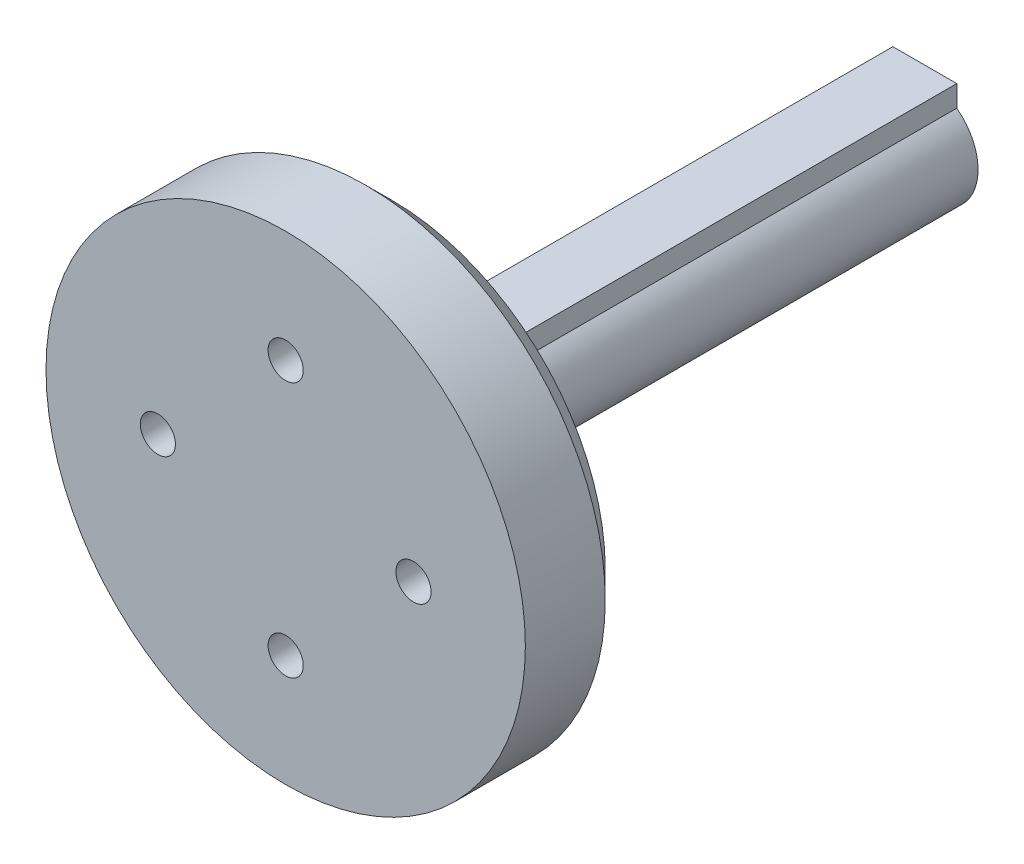
ISO-10303-21;
HEADER;
FILE_DESCRIPTION(('STEP AP214'),'2;1');
FILE_NAME('part.step','',(''),(''),'','','');
FILE_SCHEMA(('AUTOMOTIVE_DESIGN { 1 0 10303 214 1 1 1 1 }'));
ENDSEC;
DATA;
#1=APPLICATION_CONTEXT('core data for automotive mechanical design processes');
#2=APPLICATION_PROTOCOL_DEFINITION('international standard','automotive_design',2000,#1);
#3=PRODUCT_CONTEXT('',#1,'mechanical');
#4=PRODUCT('Part','Part','',(#3));
#5=PRODUCT_RELATED_PRODUCT_CATEGORY('part','',(#4));
#6=PRODUCT_DEFINITION_FORMATION('','',#4);
#7=PRODUCT_DEFINITION_CONTEXT('part definition',#1,'design');
#8=PRODUCT_DEFINITION('design','',#6,#7);
#9=PRODUCT_DEFINITION_SHAPE('','',#8);
#10=(LENGTH_UNIT() NAMED_UNIT(*) SI_UNIT(.MILLI.,.METRE.));
#11=(NAMED_UNIT(*) PLANE_ANGLE_UNIT() SI_UNIT($,.RADIAN.));
#12=(NAMED_UNIT(*) SI_UNIT($,.STERADIAN.) SOLID_ANGLE_UNIT());
#13=UNCERTAINTY_MEASURE_WITH_UNIT(LENGTH_MEASURE(1.E-05),#10,'distance_accuracy_value','');
#14=(GEOMETRIC_REPRESENTATION_CONTEXT(3) GLOBAL_UNCERTAINTY_ASSIGNED_CONTEXT((#13)) GLOBAL_UNIT_ASSIGNED_CONTEXT((#10,
#11,#12)) REPRESENTATION_CONTEXT('',''));
#15=CARTESIAN_POINT('',(0.,0.,0.));
#16=DIRECTION('',(0.,0.,1.));
#17=DIRECTION('',(1.,0.,0.));
#18=AXIS2_PLACEMENT_3D('',#15,#16,#17);
#19=CARTESIAN_POINT('',(-23.5,0.,-10.));
#20=DIRECTION('',(0.,0.,-1.));
#21=DIRECTION('',(-1.,0.,0.));
#22=AXIS2_PLACEMENT_3D('',#19,#20,#21);
#23=PLANE('',#22);
#24=CARTESIAN_POINT('',(-23.5,0.,-10.));
#25=DIRECTION('',(0.,0.,-1.));
#26=DIRECTION('',(-1.,0.,0.));
#27=AXIS2_PLACEMENT_3D('',#24,#25,#26);
#28=CIRCLE('',#27,20.);
#29=CARTESIAN_POINT('',(-43.5,0.,-10.));
#30=VERTEX_POINT('',#29);
#31=EDGE_CURVE('E50',#30,#30,#28,.T.);
#32=ORIENTED_EDGE('',*,*,#31,.T.);
#33=EDGE_LOOP('',(#32));
#34=FACE_BOUND('',#33,.T.);
#35=DIRECTION('',(0.,-1.,0.));
#36=VECTOR('',#35,1.);
#37=CARTESIAN_POINT('',(-19.5,0.,-10.));
#38=LINE('',#37,#36);
#39=CARTESIAN_POINT('',(-19.5,4.47213595499956,-10.));
#40=VERTEX_POINT('',#39);
#41=CARTESIAN_POINT('',(-19.5,6.99999999999998,-10.));
#42=VERTEX_POINT('',#41);
#43=EDGE_CURVE('E181',#40,#42,#38,.F.);
#44=ORIENTED_EDGE('',*,*,#43,.T.);
#45=DIRECTION('',(1.,0.,0.));
#46=VECTOR('',#45,1.);
#47=CARTESIAN_POINT('',(-23.5,6.99999999999998,-10.));
#48=LINE('',#47,#46);
#49=CARTESIAN_POINT('',(-27.5,6.99999999999998,-10.));
#50=VERTEX_POINT('',#49);
#51=EDGE_CURVE('E186',#42,#50,#48,.F.);
#52=ORIENTED_EDGE('',*,*,#51,.T.);
#53=DIRECTION('',(0.,1.,0.));
#54=VECTOR('',#53,1.);
#55=CARTESIAN_POINT('',(-27.5,0.,-10.));
#56=LINE('',#55,#54);
#57=CARTESIAN_POINT('',(-27.5,4.47213595499956,-10.));
#58=VERTEX_POINT('',#57);
#59=EDGE_CURVE('E183',#50,#58,#56,.F.);
#60=ORIENTED_EDGE('',*,*,#59,.T.);
#61=CARTESIAN_POINT('',(-23.5,0.,-10.));
#62=DIRECTION('',(0.,0.,-1.));
#63=DIRECTION('',(-1.,0.,0.));
#64=AXIS2_PLACEMENT_3D('',#61,#62,#63);
#65=CIRCLE('',#64,5.99999999999999);
#66=EDGE_CURVE('E179',#58,#40,#65,.F.);
#67=ORIENTED_EDGE('',*,*,#66,.T.);
#68=EDGE_LOOP('',(#44,#52,#60,#67));
#69=FACE_BOUND('',#68,.T.);
#70=CARTESIAN_POINT('',(-11.5,0.,-10.));
#71=DIRECTION('',(0.,0.,-1.));
#72=DIRECTION('',(-1.,0.,0.));
#73=AXIS2_PLACEMENT_3D('',#70,#71,#72);
#74=CIRCLE('',#73,3.64999999999981);
#75=CARTESIAN_POINT('',(-15.1499999999998,0.,-10.));
#76=VERTEX_POINT('',#75);
#77=EDGE_CURVE('E143',#76,#76,#74,.T.);
#78=ORIENTED_EDGE('',*,*,#77,.F.);
#79=EDGE_LOOP('',(#78));
#80=FACE_BOUND('',#79,.T.);
#81=CARTESIAN_POINT('',(-23.5,12.,-10.));
#82=DIRECTION('',(0.,0.,-1.));
#83=DIRECTION('',(-1.,0.,0.));
#84=AXIS2_PLACEMENT_3D('',#81,#82,#83);
#85=CIRCLE('',#84,3.64999999999981);
#86=CARTESIAN_POINT('',(-27.1499999999999,12.,-10.));
#87=VERTEX_POINT('',#86);
#88=EDGE_CURVE('E173',#87,#87,#85,.T.);
#89=ORIENTED_EDGE('',*,*,#88,.F.);
#90=EDGE_LOOP('',(#89));
#91=FACE_BOUND('',#90,.T.);
#92=CARTESIAN_POINT('',(-35.5,0.,-10.));
#93=DIRECTION('',(0.,0.,-1.));
#94=DIRECTION('',(-1.,0.,0.));
#95=AXIS2_PLACEMENT_3D('',#92,#93,#94);
#96=CIRCLE('',#95,3.64999999999981);
#97=CARTESIAN_POINT('',(-39.1499999999999,0.,-10.));
#98=VERTEX_POINT('',#97);
#99=EDGE_CURVE('E170',#98,#98,#96,.T.);
#100=ORIENTED_EDGE('',*,*,#99,.F.);
#101=EDGE_LOOP('',(#100));
#102=FACE_BOUND('',#101,.T.);
#103=CARTESIAN_POINT('',(-23.4999999999999,-12.,-10.));
#104=DIRECTION('',(0.,0.,-1.));
#105=DIRECTION('',(-1.,0.,0.));
#106=AXIS2_PLACEMENT_3D('',#103,#104,#105);
#107=CIRCLE('',#106,3.64999999999981);
#108=CARTESIAN_POINT('',(-27.1499999999997,-12.,-10.));
#109=VERTEX_POINT('',#108);
#110=EDGE_CURVE('E167',#109,#109,#107,.T.);
#111=ORIENTED_EDGE('',*,*,#110,.F.);
#112=EDGE_LOOP('',(#111));
#113=FACE_BOUND('',#112,.T.);
#114=ADVANCED_FACE('F41',(#34,#69,#80,#91,#102,#113),#23,.T.);
#115=CARTESIAN_POINT('',(-35.5000000000001,0.,-10.));
#116=DIRECTION('',(0.,0.,1.));
#117=DIRECTION('',(1.,0.,0.));
#118=AXIS2_PLACEMENT_3D('',#115,#116,#117);
#119=CYLINDRICAL_SURFACE('',#118,1.64999999999996);
#120=CARTESIAN_POINT('',(-35.5000000000001,0.,0.));
#121=DIRECTION('',(0.,0.,-1.));
#122=DIRECTION('',(-1.,0.,0.));
#123=AXIS2_PLACEMENT_3D('',#120,#121,#122);
#124=CIRCLE('',#123,1.64999999999996);
#125=CARTESIAN_POINT('',(-37.15,0.,0.));
#126=VERTEX_POINT('',#125);
#127=EDGE_CURVE('E149',#126,#126,#124,.T.);
#128=ORIENTED_EDGE('',*,*,#127,.F.);
#129=EDGE_LOOP('',(#128));
#130=FACE_BOUND('',#129,.T.);
#131=CARTESIAN_POINT('',(-35.5000000000001,0.,-5.));
#132=DIRECTION('',(0.,0.,-1.));
#133=DIRECTION('',(-1.,0.,0.));
#134=AXIS2_PLACEMENT_3D('',#131,#132,#133);
#135=CIRCLE('',#134,1.64999999999996);
#136=CARTESIAN_POINT('',(-37.15,0.,-5.));
#137=VERTEX_POINT('',#136);
#138=EDGE_CURVE('E164',#137,#137,#135,.T.);
#139=ORIENTED_EDGE('',*,*,#138,.T.);
#140=EDGE_LOOP('',(#139));
#141=FACE_BOUND('',#140,.T.);
#142=ADVANCED_FACE('F234',(#130,#141),#119,.F.);
#143=CARTESIAN_POINT('',(-23.5,12.,-10.));
#144=DIRECTION('',(0.,0.,1.));
#145=DIRECTION('',(1.,0.,0.));
#146=AXIS2_PLACEMENT_3D('',#143,#144,#145);
#147=CYLINDRICAL_SURFACE('',#146,1.65);
#148=CARTESIAN_POINT('',(-23.5,12.,0.));
#149=DIRECTION('',(0.,0.,-1.));
#150=DIRECTION('',(-1.,0.,0.));
#151=AXIS2_PLACEMENT_3D('',#148,#149,#150);
#152=CIRCLE('',#151,1.65);
#153=CARTESIAN_POINT('',(-25.15,12.,0.));
#154=VERTEX_POINT('',#153);
#155=EDGE_CURVE('E146',#154,#154,#152,.T.);
#156=ORIENTED_EDGE('',*,*,#155,.F.);
#157=EDGE_LOOP('',(#156));
#158=FACE_BOUND('',#157,.T.);
#159=CARTESIAN_POINT('',(-23.5,12.,-5.));
#160=DIRECTION('',(0.,0.,-1.));
#161=DIRECTION('',(-1.,0.,0.));
#162=AXIS2_PLACEMENT_3D('',#159,#160,#161);
#163=CIRCLE('',#162,1.65);
#164=CARTESIAN_POINT('',(-25.15,12.,-5.));
#165=VERTEX_POINT('',#164);
#166=EDGE_CURVE('E161',#165,#165,#163,.T.);
#167=ORIENTED_EDGE('',*,*,#166,.T.);
#168=EDGE_LOOP('',(#167));
#169=FACE_BOUND('',#168,.T.);
#170=ADVANCED_FACE('F239',(#158,#169),#147,.F.);
#171=CARTESIAN_POINT('',(-23.5,-12.,-10.));
#172=DIRECTION('',(0.,0.,1.));
#173=DIRECTION('',(1.,0.,0.));
#174=AXIS2_PLACEMENT_3D('',#171,#172,#173);
#175=CYLINDRICAL_SURFACE('',#174,1.65);
#176=CARTESIAN_POINT('',(-23.5,-12.,0.));
#177=DIRECTION('',(0.,0.,-1.));
#178=DIRECTION('',(-1.,0.,0.));
#179=AXIS2_PLACEMENT_3D('',#176,#177,#178);
#180=CIRCLE('',#179,1.65);
#181=CARTESIAN_POINT('',(-25.1500000000001,-12.,0.));
#182=VERTEX_POINT('',#181);
#183=EDGE_CURVE('E142',#182,#182,#180,.T.);
#184=ORIENTED_EDGE('',*,*,#183,.F.);
#185=EDGE_LOOP('',(#184));
#186=FACE_BOUND('',#185,.T.);
#187=CARTESIAN_POINT('',(-23.5,-12.,-5.));
#188=DIRECTION('',(0.,0.,-1.));
#189=DIRECTION('',(-1.,0.,0.));
#190=AXIS2_PLACEMENT_3D('',#187,#188,#189);
#191=CIRCLE('',#190,1.65);
#192=CARTESIAN_POINT('',(-25.1500000000001,-12.,-5.));
#193=VERTEX_POINT('',#192);
#194=EDGE_CURVE('E158',#193,#193,#191,.T.);
#195=ORIENTED_EDGE('',*,*,#194,.T.);
#196=EDGE_LOOP('',(#195));
#197=FACE_BOUND('',#196,.T.);
#198=ADVANCED_FACE('F271',(#186,#197),#175,.F.);
#199=CARTESIAN_POINT('',(-11.5,0.,-10.));
#200=DIRECTION('',(0.,0.,1.));
#201=DIRECTION('',(1.,0.,0.));
#202=AXIS2_PLACEMENT_3D('',#199,#200,#201);
#203=CYLINDRICAL_SURFACE('',#202,1.64999999999981);
#204=CARTESIAN_POINT('',(-11.5,0.,0.));
#205=DIRECTION('',(0.,0.,-1.));
#206=DIRECTION('',(-1.,0.,0.));
#207=AXIS2_PLACEMENT_3D('',#204,#205,#206);
#208=CIRCLE('',#207,1.64999999999981);
#209=CARTESIAN_POINT('',(-13.1499999999998,0.,0.));
#210=VERTEX_POINT('',#209);
#211=EDGE_CURVE('E139',#210,#210,#208,.T.);
#212=ORIENTED_EDGE('',*,*,#211,.F.);
#213=EDGE_LOOP('',(#212));
#214=FACE_BOUND('',#213,.T.);
#215=CARTESIAN_POINT('',(-11.5,0.,-5.));
#216=DIRECTION('',(0.,0.,-1.));
#217=DIRECTION('',(-1.,0.,0.));
#218=AXIS2_PLACEMENT_3D('',#215,#216,#217);
#219=CIRCLE('',#218,1.64999999999981);
#220=CARTESIAN_POINT('',(-13.1499999999998,0.,-5.));
#221=VERTEX_POINT('',#220);
#222=EDGE_CURVE('E133',#221,#221,#219,.T.);
#223=ORIENTED_EDGE('',*,*,#222,.T.);
#224=EDGE_LOOP('',(#223));
#225=FACE_BOUND('',#224,.T.);
#226=ADVANCED_FACE('F247',(#214,#225),#203,.F.);
#227=CARTESIAN_POINT('',(-23.5,0.,0.));
#228=DIRECTION('',(0.,0.,-1.));
#229=DIRECTION('',(-1.,0.,0.));
#230=AXIS2_PLACEMENT_3D('',#227,#228,#229);
#231=PLANE('',#230);
#232=CARTESIAN_POINT('',(-23.5,0.,0.));
#233=DIRECTION('',(0.,0.,-1.));
#234=DIRECTION('',(-1.,0.,0.));
#235=AXIS2_PLACEMENT_3D('',#232,#233,#234);
#236=CIRCLE('',#235,22.5);
#237=CARTESIAN_POINT('',(-46.,0.,0.));
#238=VERTEX_POINT('',#237);
#239=EDGE_CURVE('E152',#238,#238,#236,.T.);
#240=ORIENTED_EDGE('',*,*,#239,.F.);
#241=EDGE_LOOP('',(#240));
#242=FACE_BOUND('',#241,.T.);
#243=ORIENTED_EDGE('',*,*,#127,.T.);
#244=EDGE_LOOP('',(#243));
#245=FACE_BOUND('',#244,.T.);
#246=ORIENTED_EDGE('',*,*,#155,.T.);
#247=EDGE_LOOP('',(#246));
#248=FACE_BOUND('',#247,.T.);
#249=ORIENTED_EDGE('',*,*,#183,.T.);
#250=EDGE_LOOP('',(#249));
#251=FACE_BOUND('',#250,.T.);
#252=ORIENTED_EDGE('',*,*,#211,.T.);
#253=EDGE_LOOP('',(#252));
#254=FACE_BOUND('',#253,.T.);
#255=ADVANCED_FACE('F244',(#242,#245,#248,#251,#254),#231,.F.);
#256=CARTESIAN_POINT('',(-23.5,0.,-10.));
#257=DIRECTION('',(0.,0.,1.));
#258=DIRECTION('',(1.,0.,0.));
#259=AXIS2_PLACEMENT_3D('',#256,#257,#258);
#260=CYLINDRICAL_SURFACE('',#259,22.5);
#261=CARTESIAN_POINT('',(-23.5,0.,-7.49999999999999));
#262=DIRECTION('',(0.,0.,-1.));
#263=DIRECTION('',(-1.,0.,0.));
#264=AXIS2_PLACEMENT_3D('',#261,#262,#263);
#265=CIRCLE('',#264,22.5);
#266=CARTESIAN_POINT('',(-46.,0.,-7.49999999999999));
#267=VERTEX_POINT('',#266);
#268=EDGE_CURVE('E11',#267,#267,#265,.F.);
#269=ORIENTED_EDGE('',*,*,#268,.T.);
#270=EDGE_LOOP('',(#269));
#271=FACE_BOUND('',#270,.T.);
#272=ORIENTED_EDGE('',*,*,#239,.T.);
#273=EDGE_LOOP('',(#272));
#274=FACE_BOUND('',#273,.T.);
#275=ADVANCED_FACE('F246',(#271,#274),#260,.T.);
#276=CARTESIAN_POINT('',(-11.5,0.,-5.));
#277=DIRECTION('',(0.,0.,-1.));
#278=DIRECTION('',(-1.,0.,0.));
#279=AXIS2_PLACEMENT_3D('',#276,#277,#278);
#280=CYLINDRICAL_SURFACE('',#279,3.64999999999981);
#281=ORIENTED_EDGE('',*,*,#77,.T.);
#282=EDGE_LOOP('',(#281));
#283=FACE_BOUND('',#282,.T.);
#284=CARTESIAN_POINT('',(-11.5,0.,-5.));
#285=DIRECTION('',(0.,0.,-1.));
#286=DIRECTION('',(-1.,0.,0.));
#287=AXIS2_PLACEMENT_3D('',#284,#285,#286);
#288=CIRCLE('',#287,3.64999999999981);
#289=CARTESIAN_POINT('',(-15.1499999999998,0.,-5.));
#290=VERTEX_POINT('',#289);
#291=EDGE_CURVE('E130',#290,#290,#288,.T.);
#292=ORIENTED_EDGE('',*,*,#291,.F.);
#293=EDGE_LOOP('',(#292));
#294=FACE_BOUND('',#293,.T.);
#295=ADVANCED_FACE('F250',(#283,#294),#280,.F.);
#296=CARTESIAN_POINT('',(-11.5,0.,-5.));
#297=DIRECTION('',(0.,0.,-1.));
#298=DIRECTION('',(-1.,0.,0.));
#299=AXIS2_PLACEMENT_3D('',#296,#297,#298);
#300=PLANE('',#299);
#301=ORIENTED_EDGE('',*,*,#222,.F.);
#302=EDGE_LOOP('',(#301));
#303=FACE_BOUND('',#302,.T.);
#304=ORIENTED_EDGE('',*,*,#291,.T.);
#305=EDGE_LOOP('',(#304));
#306=FACE_BOUND('',#305,.T.);
#307=ADVANCED_FACE('F255',(#303,#306),#300,.T.);
#308=CARTESIAN_POINT('',(-23.4999999999999,-12.,-5.));
#309=DIRECTION('',(0.,0.,-1.));
#310=DIRECTION('',(-1.,0.,0.));
#311=AXIS2_PLACEMENT_3D('',#308,#309,#310);
#312=CYLINDRICAL_SURFACE('',#311,3.64999999999981);
#313=ORIENTED_EDGE('',*,*,#110,.T.);
#314=EDGE_LOOP('',(#313));
#315=FACE_BOUND('',#314,.T.);
#316=CARTESIAN_POINT('',(-23.4999999999999,-12.,-5.));
#317=DIRECTION('',(0.,0.,-1.));
#318=DIRECTION('',(-1.,0.,0.));
#319=AXIS2_PLACEMENT_3D('',#316,#317,#318);
#320=CIRCLE('',#319,3.64999999999981);
#321=CARTESIAN_POINT('',(-27.1499999999997,-12.,-5.));
#322=VERTEX_POINT('',#321);
#323=EDGE_CURVE('E121',#322,#322,#320,.T.);
#324=ORIENTED_EDGE('',*,*,#323,.F.);
#325=EDGE_LOOP('',(#324));
#326=FACE_BOUND('',#325,.T.);
#327=ADVANCED_FACE('F277',(#315,#326),#312,.F.);
#328=CARTESIAN_POINT('',(-23.4999999999999,-12.,-5.));
#329=DIRECTION('',(0.,0.,-1.));
#330=DIRECTION('',(-1.,0.,0.));
#331=AXIS2_PLACEMENT_3D('',#328,#329,#330);
#332=PLANE('',#331);
#333=ORIENTED_EDGE('',*,*,#194,.F.);
#334=EDGE_LOOP('',(#333));
#335=FACE_BOUND('',#334,.T.);
#336=ORIENTED_EDGE('',*,*,#323,.T.);
#337=EDGE_LOOP('',(#336));
#338=FACE_BOUND('',#337,.T.);
#339=ADVANCED_FACE('F284',(#335,#338),#332,.T.);
#340=CARTESIAN_POINT('',(-23.5,12.,-5.));
#341=DIRECTION('',(0.,0.,-1.));
#342=DIRECTION('',(-1.,0.,0.));
#343=AXIS2_PLACEMENT_3D('',#340,#341,#342);
#344=CYLINDRICAL_SURFACE('',#343,3.64999999999981);
#345=ORIENTED_EDGE('',*,*,#88,.T.);
#346=EDGE_LOOP('',(#345));
#347=FACE_BOUND('',#346,.T.);
#348=CARTESIAN_POINT('',(-23.5,12.,-5.));
#349=DIRECTION('',(0.,0.,-1.));
#350=DIRECTION('',(-1.,0.,0.));
#351=AXIS2_PLACEMENT_3D('',#348,#349,#350);
#352=CIRCLE('',#351,3.64999999999981);
#353=CARTESIAN_POINT('',(-27.1499999999999,12.,-5.));
#354=VERTEX_POINT('',#353);
#355=EDGE_CURVE('E134',#354,#354,#352,.T.);
#356=ORIENTED_EDGE('',*,*,#355,.F.);
#357=EDGE_LOOP('',(#356));
#358=FACE_BOUND('',#357,.T.);
#359=ADVANCED_FACE('F290',(#347,#358),#344,.F.);
#360=CARTESIAN_POINT('',(-23.5,12.,-5.));
#361=DIRECTION('',(0.,0.,-1.));
#362=DIRECTION('',(-1.,0.,0.));
#363=AXIS2_PLACEMENT_3D('',#360,#361,#362);
#364=PLANE('',#363);
#365=ORIENTED_EDGE('',*,*,#166,.F.);
#366=EDGE_LOOP('',(#365));
#367=FACE_BOUND('',#366,.T.);
#368=ORIENTED_EDGE('',*,*,#355,.T.);
#369=EDGE_LOOP('',(#368));
#370=FACE_BOUND('',#369,.T.);
#371=ADVANCED_FACE('F293',(#367,#370),#364,.T.);
#372=CARTESIAN_POINT('',(-35.5,0.,-5.));
#373=DIRECTION('',(0.,0.,-1.));
#374=DIRECTION('',(-1.,0.,0.));
#375=AXIS2_PLACEMENT_3D('',#372,#373,#374);
#376=CYLINDRICAL_SURFACE('',#375,3.64999999999981);
#377=ORIENTED_EDGE('',*,*,#99,.T.);
#378=EDGE_LOOP('',(#377));
#379=FACE_BOUND('',#378,.T.);
#380=CARTESIAN_POINT('',(-35.5,0.,-5.));
#381=DIRECTION('',(0.,0.,-1.));
#382=DIRECTION('',(-1.,0.,0.));
#383=AXIS2_PLACEMENT_3D('',#380,#381,#382);
#384=CIRCLE('',#383,3.64999999999981);
#385=CARTESIAN_POINT('',(-39.1499999999999,0.,-5.));
#386=VERTEX_POINT('',#385);
#387=EDGE_CURVE('E124',#386,#386,#384,.T.);
#388=ORIENTED_EDGE('',*,*,#387,.F.);
#389=EDGE_LOOP('',(#388));
#390=FACE_BOUND('',#389,.T.);
#391=ADVANCED_FACE('F297',(#379,#390),#376,.F.);
#392=CARTESIAN_POINT('',(-35.5,0.,-5.));
#393=DIRECTION('',(0.,0.,-1.));
#394=DIRECTION('',(-1.,0.,0.));
#395=AXIS2_PLACEMENT_3D('',#392,#393,#394);
#396=PLANE('',#395);
#397=ORIENTED_EDGE('',*,*,#138,.F.);
#398=EDGE_LOOP('',(#397));
#399=FACE_BOUND('',#398,.T.);
#400=ORIENTED_EDGE('',*,*,#387,.T.);
#401=EDGE_LOOP('',(#400));
#402=FACE_BOUND('',#401,.T.);
#403=ADVANCED_FACE('F301',(#399,#402),#396,.T.);
#404=CARTESIAN_POINT('',(-23.5,0.,-60.));
#405=DIRECTION('',(0.,0.,1.));
#406=DIRECTION('',(1.,0.,0.));
#407=AXIS2_PLACEMENT_3D('',#404,#405,#406);
#408=CYLINDRICAL_SURFACE('',#407,4.99999999999999);
#409=DIRECTION('',(0.,0.,1.));
#410=VECTOR('',#409,1.);
#411=CARTESIAN_POINT('',(-20.5,3.99999999999998,-60.));
#412=LINE('',#411,#410);
#413=CARTESIAN_POINT('',(-20.5,3.99999999999998,-60.));
#414=VERTEX_POINT('',#413);
#415=CARTESIAN_POINT('',(-20.5,3.99999999999998,-11.));
#416=VERTEX_POINT('',#415);
#417=EDGE_CURVE('E533',#414,#416,#412,.T.);
#418=ORIENTED_EDGE('',*,*,#417,.T.);
#419=CARTESIAN_POINT('',(-23.5,0.,-11.));
#420=DIRECTION('',(0.,0.,-1.));
#421=DIRECTION('',(-1.,0.,0.));
#422=AXIS2_PLACEMENT_3D('',#419,#420,#421);
#423=CIRCLE('',#422,4.99999999999999);
#424=CARTESIAN_POINT('',(-26.5,3.99999999999998,-11.));
#425=VERTEX_POINT('',#424);
#426=EDGE_CURVE('E120',#416,#425,#423,.T.);
#427=ORIENTED_EDGE('',*,*,#426,.T.);
#428=DIRECTION('',(0.,0.,1.));
#429=VECTOR('',#428,1.);
#430=CARTESIAN_POINT('',(-26.5,3.99999999999998,-60.));
#431=LINE('',#430,#429);
#432=CARTESIAN_POINT('',(-26.5,3.99999999999998,-60.));
#433=VERTEX_POINT('',#432);
#434=EDGE_CURVE('E103',#433,#425,#431,.T.);
#435=ORIENTED_EDGE('',*,*,#434,.F.);
#436=CARTESIAN_POINT('',(-23.5,0.,-60.));
#437=DIRECTION('',(0.,0.,-1.));
#438=DIRECTION('',(-1.,0.,0.));
#439=AXIS2_PLACEMENT_3D('',#436,#437,#438);
#440=CIRCLE('',#439,4.99999999999999);
#441=EDGE_CURVE('E109',#414,#433,#440,.T.);
#442=ORIENTED_EDGE('',*,*,#441,.F.);
#443=EDGE_LOOP('',(#418,#427,#435,#442));
#444=FACE_BOUND('',#443,.T.);
#445=ADVANCED_FACE('F118',(#444),#408,.T.);
#446=CARTESIAN_POINT('',(-26.5,5.99999999999998,-60.));
#447=DIRECTION('',(1.,0.,0.));
#448=DIRECTION('',(0.,0.,-1.));
#449=AXIS2_PLACEMENT_3D('',#446,#447,#448);
#450=PLANE('',#449);
#451=ORIENTED_EDGE('',*,*,#434,.T.);
#452=DIRECTION('',(0.,1.,0.));
#453=VECTOR('',#452,1.);
#454=CARTESIAN_POINT('',(-26.5,5.99999999999998,-11.));
#455=LINE('',#454,#453);
#456=CARTESIAN_POINT('',(-26.5,5.99999999999998,-11.));
#457=VERTEX_POINT('',#456);
#458=EDGE_CURVE('E155',#425,#457,#455,.T.);
#459=ORIENTED_EDGE('',*,*,#458,.T.);
#460=DIRECTION('',(0.,0.,1.));
#461=VECTOR('',#460,1.);
#462=CARTESIAN_POINT('',(-26.5,5.99999999999998,-60.));
#463=LINE('',#462,#461);
#464=CARTESIAN_POINT('',(-26.5,5.99999999999998,-60.));
#465=VERTEX_POINT('',#464);
#466=EDGE_CURVE('E105',#465,#457,#463,.T.);
#467=ORIENTED_EDGE('',*,*,#466,.F.);
#468=DIRECTION('',(0.,1.,0.));
#469=VECTOR('',#468,1.);
#470=CARTESIAN_POINT('',(-26.5,5.99999999999998,-60.));
#471=LINE('',#470,#469);
#472=EDGE_CURVE('E98',#433,#465,#471,.T.);
#473=ORIENTED_EDGE('',*,*,#472,.F.);
#474=EDGE_LOOP('',(#451,#459,#467,#473));
#475=FACE_BOUND('',#474,.T.);
#476=ADVANCED_FACE('F100',(#475),#450,.F.);
#477=CARTESIAN_POINT('',(-20.5,5.99999999999998,-60.));
#478=DIRECTION('',(0.,-1.,0.));
#479=DIRECTION('',(0.,0.,-1.));
#480=AXIS2_PLACEMENT_3D('',#477,#478,#479);
#481=PLANE('',#480);
#482=ORIENTED_EDGE('',*,*,#466,.T.);
#483=DIRECTION('',(1.,0.,0.));
#484=VECTOR('',#483,1.);
#485=CARTESIAN_POINT('',(-20.5,5.99999999999998,-11.));
#486=LINE('',#485,#484);
#487=CARTESIAN_POINT('',(-20.5,5.99999999999998,-11.));
#488=VERTEX_POINT('',#487);
#489=EDGE_CURVE('E57',#457,#488,#486,.T.);
#490=ORIENTED_EDGE('',*,*,#489,.T.);
#491=DIRECTION('',(0.,0.,1.));
#492=VECTOR('',#491,1.);
#493=CARTESIAN_POINT('',(-20.5,5.99999999999998,-60.));
#494=LINE('',#493,#492);
#495=CARTESIAN_POINT('',(-20.5,5.99999999999998,-60.));
#496=VERTEX_POINT('',#495);
#497=EDGE_CURVE('E126',#496,#488,#494,.T.);
#498=ORIENTED_EDGE('',*,*,#497,.F.);
#499=DIRECTION('',(1.,0.,0.));
#500=VECTOR('',#499,1.);
#501=CARTESIAN_POINT('',(-20.5,5.99999999999998,-60.));
#502=LINE('',#501,#500);
#503=EDGE_CURVE('E108',#465,#496,#502,.T.);
#504=ORIENTED_EDGE('',*,*,#503,.F.);
#505=EDGE_LOOP('',(#482,#490,#498,#504));
#506=FACE_BOUND('',#505,.T.);
#507=ADVANCED_FACE('F414',(#506),#481,.F.);
#508=CARTESIAN_POINT('',(-20.5,5.99999999999998,-60.));
#509=DIRECTION('',(-1.,0.,0.));
#510=DIRECTION('',(0.,0.,1.));
#511=AXIS2_PLACEMENT_3D('',#508,#509,#510);
#512=PLANE('',#511);
#513=ORIENTED_EDGE('',*,*,#497,.T.);
#514=DIRECTION('',(0.,-1.,0.));
#515=VECTOR('',#514,1.);
#516=CARTESIAN_POINT('',(-20.5,5.99999999999998,-11.));
#517=LINE('',#516,#515);
#518=EDGE_CURVE('E64',#488,#416,#517,.T.);
#519=ORIENTED_EDGE('',*,*,#518,.T.);
#520=ORIENTED_EDGE('',*,*,#417,.F.);
#521=DIRECTION('',(0.,-1.,0.));
#522=VECTOR('',#521,1.);
#523=CARTESIAN_POINT('',(-20.5,5.99999999999998,-60.));
#524=LINE('',#523,#522);
#525=EDGE_CURVE('E114',#496,#414,#524,.T.);
#526=ORIENTED_EDGE('',*,*,#525,.F.);
#527=EDGE_LOOP('',(#513,#519,#520,#526));
#528=FACE_BOUND('',#527,.T.);
#529=ADVANCED_FACE('F422',(#528),#512,.F.);
#530=CARTESIAN_POINT('',(-23.5,0.,-60.));
#531=DIRECTION('',(0.,0.,-1.));
#532=DIRECTION('',(-1.,0.,0.));
#533=AXIS2_PLACEMENT_3D('',#530,#531,#532);
#534=PLANE('',#533);
#535=ORIENTED_EDGE('',*,*,#441,.T.);
#536=ORIENTED_EDGE('',*,*,#472,.T.);
#537=ORIENTED_EDGE('',*,*,#503,.T.);
#538=ORIENTED_EDGE('',*,*,#525,.T.);
#539=EDGE_LOOP('',(#535,#536,#537,#538));
#540=FACE_BOUND('',#539,.T.);
#541=ADVANCED_FACE('F112',(#540),#534,.T.);
#542=CARTESIAN_POINT('',(-19.5,5.99999999999998,-11.));
#543=DIRECTION('',(0.,-1.,0.));
#544=DIRECTION('',(0.,0.,-1.));
#545=AXIS2_PLACEMENT_3D('',#542,#543,#544);
#546=CYLINDRICAL_SURFACE('',#545,1.);
#547=CARTESIAN_POINT('',(-19.5,6.99999999999998,-11.));
#548=DIRECTION('',(0.707106781186547,-0.707106781186547,0.));
#549=DIRECTION('',(0.707106781186547,0.707106781186547,0.));
#550=AXIS2_PLACEMENT_3D('',#547,#548,#549);
#551=ELLIPSE('',#550,1.41421356237309,1.);
#552=EDGE_CURVE('E201',#42,#488,#551,.T.);
#553=ORIENTED_EDGE('',*,*,#552,.F.);
#554=ORIENTED_EDGE('',*,*,#43,.F.);
#555=CARTESIAN_POINT('',(-20.5,3.99999999999998,-11.));
#556=CARTESIAN_POINT('',(-20.5000012438268,3.99999905732465,-10.9739321977858));
#557=CARTESIAN_POINT('',(-20.4989799638644,4.00051004898051,-10.9478778247349));
#558=CARTESIAN_POINT('',(-20.4949151837122,4.00254179514096,-10.8959743592242));
#559=CARTESIAN_POINT('',(-20.4918722669045,4.00406225834305,-10.8701252097202));
#560=CARTESIAN_POINT('',(-20.4797810929303,4.01009883235994,-10.793363476911));
#561=CARTESIAN_POINT('',(-20.467769932234,4.01609041334422,-10.7429969193244));
#562=CARTESIAN_POINT('',(-20.4363854932814,4.03168919331298,-10.645290640528));
#563=CARTESIAN_POINT('',(-20.4170171367645,4.04129397513508,-10.597948920474));
#564=CARTESIAN_POINT('',(-20.3716862570753,4.06366579425968,-10.5073219748711));
#565=CARTESIAN_POINT('',(-20.3457192877549,4.07643496358341,-10.4640395114792));
#566=CARTESIAN_POINT('',(-20.2868006465798,4.10524217876729,-10.3805887881487));
#567=CARTESIAN_POINT('',(-20.2535877671423,4.1214012289184,-10.340647529739));
#568=CARTESIAN_POINT('',(-20.1820049989857,4.15599316010114,-10.2668463082692));
#569=CARTESIAN_POINT('',(-20.1436335060813,4.17442674830377,-10.2329882445966));
#570=CARTESIAN_POINT('',(-20.0587411427197,4.21491210058188,-10.1687876063085));
#571=CARTESIAN_POINT('',(-20.0117894565853,4.23714138958208,-10.1391269050184));
#572=CARTESIAN_POINT('',(-19.9141599389986,4.28297626426392,-10.0881301022535));
#573=CARTESIAN_POINT('',(-19.8634799082416,4.30658266055688,-10.0667989618431));
#574=CARTESIAN_POINT('',(-19.7622525055283,4.35333316081987,-10.0336047302119));
#575=CARTESIAN_POINT('',(-19.7118245523747,4.37644161272162,-10.021322529613));
#576=CARTESIAN_POINT('',(-19.6098319110797,4.42280541744814,-10.0047126407078));
#577=CARTESIAN_POINT('',(-19.5582699370463,4.44606034087054,-10.0003676910682));
#578=CARTESIAN_POINT('',(-19.5044580430508,4.47014192700055,-10.0000074360126));
#579=CARTESIAN_POINT('',(-19.5022290168506,4.47113911135908,-9.99999998189141));
#580=CARTESIAN_POINT('',(-19.5,4.47213595499956,-10.));
#581=B_SPLINE_CURVE_WITH_KNOTS('',3,(#555,#556,#557,#558,#559,#560,#561,#562,#563,#564,#565,
#566,#567,#568,#569,#570,#571,#572,#573,#574,#575,#576,#577,#578,#579,#580),.UNSPECIFIED.,.F.,
.F.,(4,2,2,2,2,2,2,2,2,2,2,2,4),(0.,0.0781522080583231,0.156281873586563,0.31183185721918,
0.467277965401311,0.62282909225236,0.78536259631327,0.947946761197452,1.12665850933433,
1.30547653595316,1.47537718354605,1.644907902176,1.65223361935549),.UNSPECIFIED.);
#582=EDGE_CURVE('E116',#416,#40,#581,.T.);
#583=ORIENTED_EDGE('',*,*,#582,.F.);
#584=ORIENTED_EDGE('',*,*,#518,.F.);
#585=EDGE_LOOP('',(#553,#554,#583,#584));
#586=FACE_BOUND('',#585,.T.);
#587=ADVANCED_FACE('F214',(#586),#546,.F.);
#588=CARTESIAN_POINT('',(-23.5,0.,-11.));
#589=DIRECTION('',(0.,0.,-1.));
#590=DIRECTION('',(-1.,0.,0.));
#591=AXIS2_PLACEMENT_3D('',#588,#589,#590);
#592=TOROIDAL_SURFACE('',#591,5.99999999999999,1.);
#593=ORIENTED_EDGE('',*,*,#582,.T.);
#594=ORIENTED_EDGE('',*,*,#66,.F.);
#595=CARTESIAN_POINT('',(-26.5,3.99999999999998,-11.));
#596=CARTESIAN_POINT('',(-26.4999987561733,3.99999905732465,-10.9739321977858));
#597=CARTESIAN_POINT('',(-26.5010200361357,4.00051004898052,-10.9478778247349));
#598=CARTESIAN_POINT('',(-26.5050848162879,4.00254179514096,-10.8959743592242));
#599=CARTESIAN_POINT('',(-26.5081277330956,4.00406225834306,-10.8701252097202));
#600=CARTESIAN_POINT('',(-26.5202189070698,4.01009883235995,-10.793363476911));
#601=CARTESIAN_POINT('',(-26.5322300677661,4.01609041334423,-10.7429969193244));
#602=CARTESIAN_POINT('',(-26.5636145067186,4.03168919331299,-10.645290640528));
#603=CARTESIAN_POINT('',(-26.5829828632356,4.04129397513508,-10.597948920474));
#604=CARTESIAN_POINT('',(-26.6283137429248,4.06366579425969,-10.5073219748711));
#605=CARTESIAN_POINT('',(-26.6542807122451,4.07643496358341,-10.4640395114792));
#606=CARTESIAN_POINT('',(-26.7131993534203,4.10524217876729,-10.3805887881487));
#607=CARTESIAN_POINT('',(-26.7464122328578,4.1214012289184,-10.340647529739));
#608=CARTESIAN_POINT('',(-26.8179950010143,4.15599316010114,-10.2668463082692));
#609=CARTESIAN_POINT('',(-26.8563664939188,4.17442674830377,-10.2329882445966));
#610=CARTESIAN_POINT('',(-26.9412588572804,4.21491210058189,-10.1687876063085));
#611=CARTESIAN_POINT('',(-26.9882105434148,4.23714138958209,-10.1391269050184));
#612=CARTESIAN_POINT('',(-27.0858400610015,4.28297626426393,-10.0881301022535));
#613=CARTESIAN_POINT('',(-27.1365200917585,4.30658266055687,-10.0667989618431));
#614=CARTESIAN_POINT('',(-27.2377474944717,4.35333316081987,-10.0336047302119));
#615=CARTESIAN_POINT('',(-27.2881754476254,4.37644161272163,-10.021322529613));
#616=CARTESIAN_POINT('',(-27.3901680889203,4.42280541744813,-10.0047126407078));
#617=CARTESIAN_POINT('',(-27.4417300629538,4.44606034087051,-10.0003676910682));
#618=CARTESIAN_POINT('',(-27.4955419569493,4.47014192700055,-10.0000074360126));
#619=CARTESIAN_POINT('',(-27.4977709831494,4.47113911135908,-9.99999998189141));
#620=CARTESIAN_POINT('',(-27.5,4.47213595499956,-10.));
#621=B_SPLINE_CURVE_WITH_KNOTS('',3,(#595,#596,#597,#598,#599,#600,#601,#602,#603,#604,#605,
#606,#607,#608,#609,#610,#611,#612,#613,#614,#615,#616,#617,#618,#619,#620),.UNSPECIFIED.,.F.,
.F.,(4,2,2,2,2,2,2,2,2,2,2,2,4),(0.,0.0781522080583231,0.156281873586563,0.31183185721918,
0.467277965401313,0.62282909225236,0.78536259631327,0.947946761197452,1.12665850933433,
1.30547653595316,1.47537718354605,1.644907902176,1.65223361935549),.UNSPECIFIED.);
#622=EDGE_CURVE('E193',#425,#58,#621,.T.);
#623=ORIENTED_EDGE('',*,*,#622,.F.);
#624=ORIENTED_EDGE('',*,*,#426,.F.);
#625=EDGE_LOOP('',(#593,#594,#623,#624));
#626=FACE_BOUND('',#625,.T.);
#627=ADVANCED_FACE('F203',(#626),#592,.F.);
#628=CARTESIAN_POINT('',(-20.5,6.99999999999998,-11.));
#629=DIRECTION('',(1.,0.,0.));
#630=DIRECTION('',(0.,0.,-1.));
#631=AXIS2_PLACEMENT_3D('',#628,#629,#630);
#632=CYLINDRICAL_SURFACE('',#631,1.);
#633=ORIENTED_EDGE('',*,*,#552,.T.);
#634=ORIENTED_EDGE('',*,*,#489,.F.);
#635=CARTESIAN_POINT('',(-27.5,6.99999999999998,-11.));
#636=DIRECTION('',(0.707106781186547,0.707106781186547,0.));
#637=DIRECTION('',(0.707106781186547,-0.707106781186547,0.));
#638=AXIS2_PLACEMENT_3D('',#635,#636,#637);
#639=ELLIPSE('',#638,1.41421356237309,1.);
#640=EDGE_CURVE('E191',#50,#457,#639,.T.);
#641=ORIENTED_EDGE('',*,*,#640,.F.);
#642=ORIENTED_EDGE('',*,*,#51,.F.);
#643=EDGE_LOOP('',(#633,#634,#641,#642));
#644=FACE_BOUND('',#643,.T.);
#645=ADVANCED_FACE('F210',(#644),#632,.F.);
#646=CARTESIAN_POINT('',(-27.5,5.99999999999998,-11.));
#647=DIRECTION('',(0.,1.,0.));
#648=DIRECTION('',(0.,0.,1.));
#649=AXIS2_PLACEMENT_3D('',#646,#647,#648);
#650=CYLINDRICAL_SURFACE('',#649,1.);
#651=ORIENTED_EDGE('',*,*,#622,.T.);
#652=ORIENTED_EDGE('',*,*,#59,.F.);
#653=ORIENTED_EDGE('',*,*,#640,.T.);
#654=ORIENTED_EDGE('',*,*,#458,.F.);
#655=EDGE_LOOP('',(#651,#652,#653,#654));
#656=FACE_BOUND('',#655,.T.);
#657=ADVANCED_FACE('F206',(#656),#650,.F.);
#658=CARTESIAN_POINT('',(-23.5,0.,-10.));
#659=DIRECTION('',(0.,0.,1.));
#660=DIRECTION('',(1.,0.,0.));
#661=AXIS2_PLACEMENT_3D('',#658,#659,#660);
#662=CONICAL_SURFACE('',#661,20.,0.785398163397446);
#663=ORIENTED_EDGE('',*,*,#268,.F.);
#664=EDGE_LOOP('',(#663));
#665=FACE_BOUND('',#664,.T.);
#666=ORIENTED_EDGE('',*,*,#31,.F.);
#667=EDGE_LOOP('',(#666));
#668=FACE_BOUND('',#667,.T.);
#669=ADVANCED_FACE('F44',(#665,#668),#662,.T.);
#670=CLOSED_SHELL('',(#114,#142,#170,#198,#226,#255,#275,#295,#307,#327,#339,#359,#371,#391,
#403,#445,#476,#507,#529,#541,#587,#627,#645,#657,#669));
#671=MANIFOLD_SOLID_BREP('B2',#670);
#672=ADVANCED_BREP_SHAPE_REPRESENTATION('',(#18,#671),#14);
#673=SHAPE_DEFINITION_REPRESENTATION(#9,#672);
ENDSEC;
END-ISO-10303-21;
